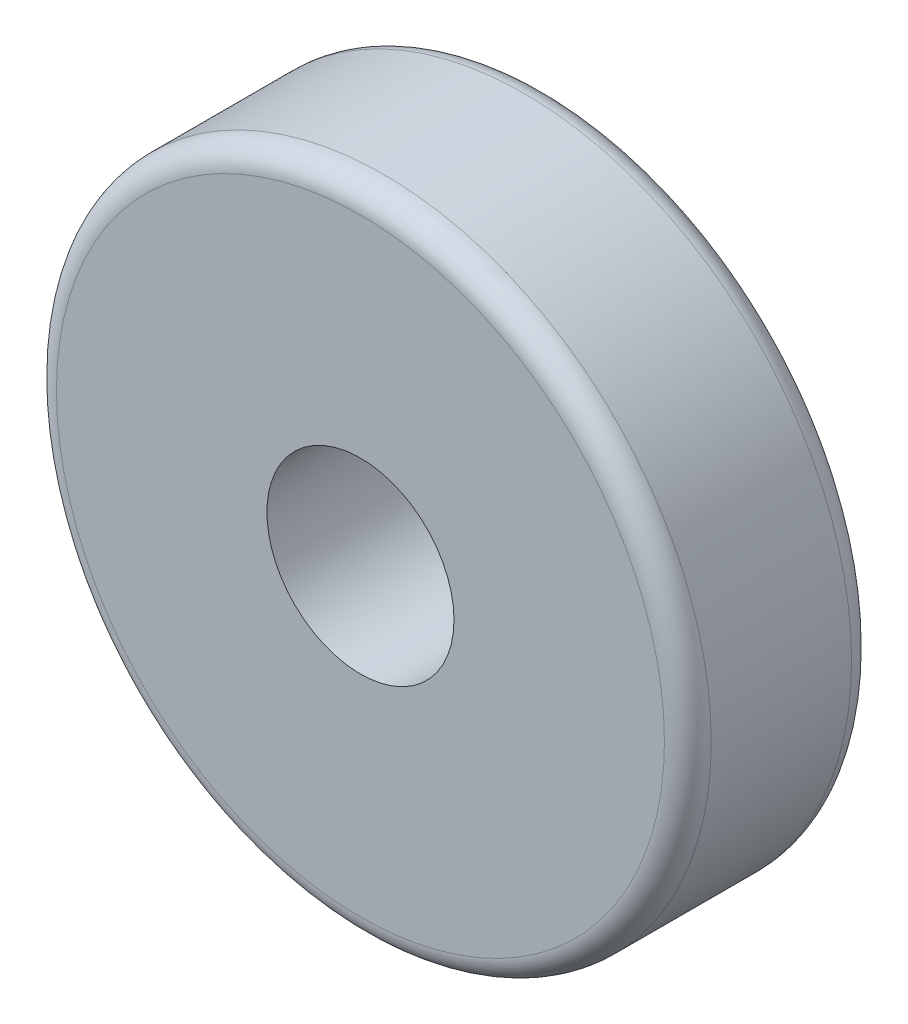
ISO-10303-21;
HEADER;
FILE_DESCRIPTION(('STEP AP214'),'2;1');
FILE_NAME('part.step','',(''),(''),'','','');
FILE_SCHEMA(('AUTOMOTIVE_DESIGN { 1 0 10303 214 1 1 1 1 }'));
ENDSEC;
DATA;
#1=APPLICATION_CONTEXT('core data for automotive mechanical design processes');
#2=APPLICATION_PROTOCOL_DEFINITION('international standard','automotive_design',2000,#1);
#3=PRODUCT_CONTEXT('',#1,'mechanical');
#4=PRODUCT('Part','Part','',(#3));
#5=PRODUCT_RELATED_PRODUCT_CATEGORY('part','',(#4));
#6=PRODUCT_DEFINITION_FORMATION('','',#4);
#7=PRODUCT_DEFINITION_CONTEXT('part definition',#1,'design');
#8=PRODUCT_DEFINITION('design','',#6,#7);
#9=PRODUCT_DEFINITION_SHAPE('','',#8);
#10=(LENGTH_UNIT() NAMED_UNIT(*) SI_UNIT(.MILLI.,.METRE.));
#11=(NAMED_UNIT(*) PLANE_ANGLE_UNIT() SI_UNIT($,.RADIAN.));
#12=(NAMED_UNIT(*) SI_UNIT($,.STERADIAN.) SOLID_ANGLE_UNIT());
#13=UNCERTAINTY_MEASURE_WITH_UNIT(LENGTH_MEASURE(1.E-05),#10,'distance_accuracy_value','');
#14=(GEOMETRIC_REPRESENTATION_CONTEXT(3) GLOBAL_UNCERTAINTY_ASSIGNED_CONTEXT((#13)) GLOBAL_UNIT_ASSIGNED_CONTEXT((#10,
#11,#12)) REPRESENTATION_CONTEXT('',''));
#15=CARTESIAN_POINT('',(0.,0.,0.));
#16=DIRECTION('',(0.,0.,1.));
#17=DIRECTION('',(1.,0.,0.));
#18=AXIS2_PLACEMENT_3D('',#15,#16,#17);
#19=CARTESIAN_POINT('',(0.,0.,4.));
#20=DIRECTION('',(0.,0.,1.));
#21=DIRECTION('',(1.,0.,0.));
#22=AXIS2_PLACEMENT_3D('',#19,#20,#21);
#23=PLANE('',#22);
#24=CARTESIAN_POINT('',(0.,0.,4.));
#25=DIRECTION('',(0.,0.,1.));
#26=DIRECTION('',(1.,0.,0.));
#27=AXIS2_PLACEMENT_3D('',#24,#25,#26);
#28=CIRCLE('',#27,6.5);
#29=CARTESIAN_POINT('',(6.5,0.,4.));
#30=VERTEX_POINT('',#29);
#31=EDGE_CURVE('E10',#30,#30,#28,.T.);
#32=ORIENTED_EDGE('',*,*,#31,.T.);
#33=EDGE_LOOP('',(#32));
#34=FACE_BOUND('',#33,.T.);
#35=CARTESIAN_POINT('',(0.,0.,4.));
#36=DIRECTION('',(0.,0.,1.));
#37=DIRECTION('',(1.,0.,0.));
#38=AXIS2_PLACEMENT_3D('',#35,#36,#37);
#39=CIRCLE('',#38,2.);
#40=CARTESIAN_POINT('',(2.,0.,4.));
#41=VERTEX_POINT('',#40);
#42=EDGE_CURVE('E67',#41,#41,#39,.T.);
#43=ORIENTED_EDGE('',*,*,#42,.F.);
#44=EDGE_LOOP('',(#43));
#45=FACE_BOUND('',#44,.T.);
#46=ADVANCED_FACE('F43',(#34,#45),#23,.T.);
#47=CARTESIAN_POINT('',(0.,0.,0.));
#48=DIRECTION('',(0.,0.,1.));
#49=DIRECTION('',(1.,0.,0.));
#50=AXIS2_PLACEMENT_3D('',#47,#48,#49);
#51=PLANE('',#50);
#52=CARTESIAN_POINT('',(0.,0.,0.));
#53=DIRECTION('',(0.,0.,1.));
#54=DIRECTION('',(1.,0.,0.));
#55=AXIS2_PLACEMENT_3D('',#52,#53,#54);
#56=CIRCLE('',#55,6.5);
#57=CARTESIAN_POINT('',(6.5,0.,0.));
#58=VERTEX_POINT('',#57);
#59=EDGE_CURVE('E51',#58,#58,#56,.F.);
#60=ORIENTED_EDGE('',*,*,#59,.T.);
#61=EDGE_LOOP('',(#60));
#62=FACE_BOUND('',#61,.T.);
#63=CARTESIAN_POINT('',(0.,0.,0.));
#64=DIRECTION('',(0.,0.,1.));
#65=DIRECTION('',(1.,0.,0.));
#66=AXIS2_PLACEMENT_3D('',#63,#64,#65);
#67=CIRCLE('',#66,2.);
#68=CARTESIAN_POINT('',(2.,0.,0.));
#69=VERTEX_POINT('',#68);
#70=EDGE_CURVE('E68',#69,#69,#67,.T.);
#71=ORIENTED_EDGE('',*,*,#70,.T.);
#72=EDGE_LOOP('',(#71));
#73=FACE_BOUND('',#72,.T.);
#74=ADVANCED_FACE('F80',(#62,#73),#51,.F.);
#75=CARTESIAN_POINT('',(0.,0.,4.));
#76=DIRECTION('',(0.,0.,-1.));
#77=DIRECTION('',(-1.,0.,0.));
#78=AXIS2_PLACEMENT_3D('',#75,#76,#77);
#79=CYLINDRICAL_SURFACE('',#78,7.);
#80=CARTESIAN_POINT('',(0.,0.,0.5));
#81=DIRECTION('',(0.,0.,1.));
#82=DIRECTION('',(1.,0.,0.));
#83=AXIS2_PLACEMENT_3D('',#80,#81,#82);
#84=CIRCLE('',#83,7.);
#85=CARTESIAN_POINT('',(7.,0.,0.5));
#86=VERTEX_POINT('',#85);
#87=EDGE_CURVE('E56',#86,#86,#84,.T.);
#88=ORIENTED_EDGE('',*,*,#87,.T.);
#89=EDGE_LOOP('',(#88));
#90=FACE_BOUND('',#89,.T.);
#91=CARTESIAN_POINT('',(0.,0.,3.5));
#92=DIRECTION('',(0.,0.,1.));
#93=DIRECTION('',(1.,0.,0.));
#94=AXIS2_PLACEMENT_3D('',#91,#92,#93);
#95=CIRCLE('',#94,7.);
#96=CARTESIAN_POINT('',(7.,0.,3.5));
#97=VERTEX_POINT('',#96);
#98=EDGE_CURVE('E61',#97,#97,#95,.F.);
#99=ORIENTED_EDGE('',*,*,#98,.T.);
#100=EDGE_LOOP('',(#99));
#101=FACE_BOUND('',#100,.T.);
#102=ADVANCED_FACE('F86',(#90,#101),#79,.T.);
#103=CARTESIAN_POINT('',(0.,0.,4.));
#104=DIRECTION('',(0.,0.,-1.));
#105=DIRECTION('',(-1.,0.,0.));
#106=AXIS2_PLACEMENT_3D('',#103,#104,#105);
#107=CYLINDRICAL_SURFACE('',#106,2.);
#108=ORIENTED_EDGE('',*,*,#42,.T.);
#109=EDGE_LOOP('',(#108));
#110=FACE_BOUND('',#109,.T.);
#111=ORIENTED_EDGE('',*,*,#70,.F.);
#112=EDGE_LOOP('',(#111));
#113=FACE_BOUND('',#112,.T.);
#114=ADVANCED_FACE('F76',(#110,#113),#107,.F.);
#115=CARTESIAN_POINT('',(0.,0.,0.5));
#116=DIRECTION('',(0.,0.,1.));
#117=DIRECTION('',(1.,0.,0.));
#118=AXIS2_PLACEMENT_3D('',#115,#116,#117);
#119=TOROIDAL_SURFACE('',#118,6.5,0.5);
#120=ORIENTED_EDGE('',*,*,#59,.F.);
#121=EDGE_LOOP('',(#120));
#122=FACE_BOUND('',#121,.T.);
#123=ORIENTED_EDGE('',*,*,#87,.F.);
#124=EDGE_LOOP('',(#123));
#125=FACE_BOUND('',#124,.T.);
#126=ADVANCED_FACE('F92',(#122,#125),#119,.T.);
#127=CARTESIAN_POINT('',(0.,0.,3.5));
#128=DIRECTION('',(0.,0.,1.));
#129=DIRECTION('',(1.,0.,0.));
#130=AXIS2_PLACEMENT_3D('',#127,#128,#129);
#131=TOROIDAL_SURFACE('',#130,6.5,0.5);
#132=ORIENTED_EDGE('',*,*,#98,.F.);
#133=EDGE_LOOP('',(#132));
#134=FACE_BOUND('',#133,.T.);
#135=ORIENTED_EDGE('',*,*,#31,.F.);
#136=EDGE_LOOP('',(#135));
#137=FACE_BOUND('',#136,.T.);
#138=ADVANCED_FACE('F45',(#134,#137),#131,.T.);
#139=CLOSED_SHELL('',(#46,#74,#102,#114,#126,#138));
#140=MANIFOLD_SOLID_BREP('B2',#139);
#141=ADVANCED_BREP_SHAPE_REPRESENTATION('',(#18,#140),#14);
#142=SHAPE_DEFINITION_REPRESENTATION(#9,#141);
ENDSEC;
END-ISO-10303-21;
